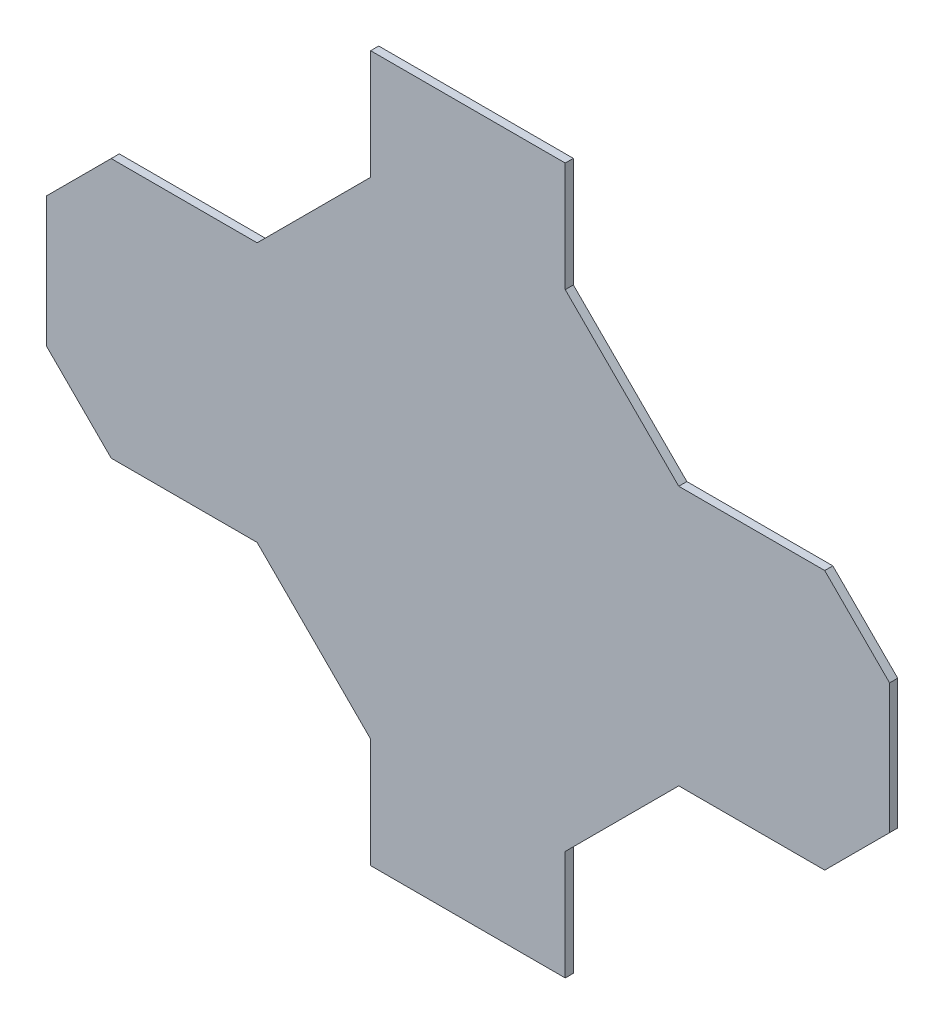
ISO-10303-21;
HEADER;
FILE_DESCRIPTION(('STEP AP214'),'2;1');
FILE_NAME('part.step','',(''),(''),'','','');
FILE_SCHEMA(('AUTOMOTIVE_DESIGN { 1 0 10303 214 1 1 1 1 }'));
ENDSEC;
DATA;
#1=APPLICATION_CONTEXT('core data for automotive mechanical design processes');
#2=APPLICATION_PROTOCOL_DEFINITION('international standard','automotive_design',2000,#1);
#3=PRODUCT_CONTEXT('',#1,'mechanical');
#4=PRODUCT('Part','Part','',(#3));
#5=PRODUCT_RELATED_PRODUCT_CATEGORY('part','',(#4));
#6=PRODUCT_DEFINITION_FORMATION('','',#4);
#7=PRODUCT_DEFINITION_CONTEXT('part definition',#1,'design');
#8=PRODUCT_DEFINITION('design','',#6,#7);
#9=PRODUCT_DEFINITION_SHAPE('','',#8);
#10=(LENGTH_UNIT() NAMED_UNIT(*) SI_UNIT(.MILLI.,.METRE.));
#11=(NAMED_UNIT(*) PLANE_ANGLE_UNIT() SI_UNIT($,.RADIAN.));
#12=(NAMED_UNIT(*) SI_UNIT($,.STERADIAN.) SOLID_ANGLE_UNIT());
#13=UNCERTAINTY_MEASURE_WITH_UNIT(LENGTH_MEASURE(1.E-05),#10,'distance_accuracy_value','');
#14=(GEOMETRIC_REPRESENTATION_CONTEXT(3) GLOBAL_UNCERTAINTY_ASSIGNED_CONTEXT((#13)) GLOBAL_UNIT_ASSIGNED_CONTEXT((#10,
#11,#12)) REPRESENTATION_CONTEXT('',''));
#15=CARTESIAN_POINT('',(0.,0.,0.));
#16=DIRECTION('',(0.,0.,1.));
#17=DIRECTION('',(1.,0.,0.));
#18=AXIS2_PLACEMENT_3D('',#15,#16,#17);
#19=CARTESIAN_POINT('',(-60.,0.,5.));
#20=DIRECTION('',(-1.,0.,0.));
#21=DIRECTION('',(0.,0.,1.));
#22=AXIS2_PLACEMENT_3D('',#19,#20,#21);
#23=PLANE('',#22);
#24=DIRECTION('',(0.,1.,0.));
#25=VECTOR('',#24,1.);
#26=CARTESIAN_POINT('',(-60.,0.,0.));
#27=LINE('',#26,#25);
#28=CARTESIAN_POINT('',(-60.,325.,0.));
#29=VERTEX_POINT('',#28);
#30=CARTESIAN_POINT('',(-60.,392.6,0.));
#31=VERTEX_POINT('',#30);
#32=EDGE_CURVE('E219',#29,#31,#27,.T.);
#33=ORIENTED_EDGE('',*,*,#32,.F.);
#34=DIRECTION('',(0.,0.,1.));
#35=VECTOR('',#34,1.);
#36=CARTESIAN_POINT('',(-60.,325.,5.));
#37=LINE('',#36,#35);
#38=CARTESIAN_POINT('',(-60.,325.,5.));
#39=VERTEX_POINT('',#38);
#40=EDGE_CURVE('E256',#29,#39,#37,.T.);
#41=ORIENTED_EDGE('',*,*,#40,.T.);
#42=DIRECTION('',(0.,1.,0.));
#43=VECTOR('',#42,1.);
#44=CARTESIAN_POINT('',(-60.,0.,5.));
#45=LINE('',#44,#43);
#46=CARTESIAN_POINT('',(-60.,392.6,5.));
#47=VERTEX_POINT('',#46);
#48=EDGE_CURVE('E247',#39,#47,#45,.T.);
#49=ORIENTED_EDGE('',*,*,#48,.T.);
#50=DIRECTION('',(0.,0.,-1.));
#51=VECTOR('',#50,1.);
#52=CARTESIAN_POINT('',(-60.,392.6,5.));
#53=LINE('',#52,#51);
#54=EDGE_CURVE('E218',#47,#31,#53,.T.);
#55=ORIENTED_EDGE('',*,*,#54,.T.);
#56=EDGE_LOOP('',(#33,#41,#49,#55));
#57=FACE_BOUND('',#56,.T.);
#58=ADVANCED_FACE('F35',(#57),#23,.T.);
#59=CARTESIAN_POINT('',(0.,255.,5.));
#60=DIRECTION('',(0.,1.,0.));
#61=DIRECTION('',(0.,0.,1.));
#62=AXIS2_PLACEMENT_3D('',#59,#60,#61);
#63=PLANE('',#62);
#64=DIRECTION('',(1.,0.,0.));
#65=VECTOR('',#64,1.);
#66=CARTESIAN_POINT('',(0.,255.,0.));
#67=LINE('',#66,#65);
#68=CARTESIAN_POINT('',(-220.,255.,0.));
#69=VERTEX_POINT('',#68);
#70=CARTESIAN_POINT('',(-130.,255.,0.));
#71=VERTEX_POINT('',#70);
#72=EDGE_CURVE('E221',#69,#71,#67,.T.);
#73=ORIENTED_EDGE('',*,*,#72,.F.);
#74=DIRECTION('',(0.,0.,1.));
#75=VECTOR('',#74,1.);
#76=CARTESIAN_POINT('',(-220.,255.,5.));
#77=LINE('',#76,#75);
#78=CARTESIAN_POINT('',(-220.,255.,5.));
#79=VERTEX_POINT('',#78);
#80=EDGE_CURVE('E303',#69,#79,#77,.T.);
#81=ORIENTED_EDGE('',*,*,#80,.T.);
#82=DIRECTION('',(1.,0.,0.));
#83=VECTOR('',#82,1.);
#84=CARTESIAN_POINT('',(0.,255.,5.));
#85=LINE('',#84,#83);
#86=CARTESIAN_POINT('',(-130.,255.,5.));
#87=VERTEX_POINT('',#86);
#88=EDGE_CURVE('E354',#79,#87,#85,.T.);
#89=ORIENTED_EDGE('',*,*,#88,.T.);
#90=DIRECTION('',(0.,0.,-1.));
#91=VECTOR('',#90,1.);
#92=CARTESIAN_POINT('',(-130.,255.,0.));
#93=LINE('',#92,#91);
#94=EDGE_CURVE('E184',#87,#71,#93,.T.);
#95=ORIENTED_EDGE('',*,*,#94,.T.);
#96=EDGE_LOOP('',(#73,#81,#89,#95));
#97=FACE_BOUND('',#96,.T.);
#98=ADVANCED_FACE('F362',(#97),#63,.T.);
#99=CARTESIAN_POINT('',(-260.,0.,5.));
#100=DIRECTION('',(-1.,0.,0.));
#101=DIRECTION('',(0.,0.,1.));
#102=AXIS2_PLACEMENT_3D('',#99,#100,#101);
#103=PLANE('',#102);
#104=DIRECTION('',(0.,1.,0.));
#105=VECTOR('',#104,1.);
#106=CARTESIAN_POINT('',(-260.,0.,5.));
#107=LINE('',#106,#105);
#108=CARTESIAN_POINT('',(-260.,135.,5.));
#109=VERTEX_POINT('',#108);
#110=CARTESIAN_POINT('',(-260.,215.,5.));
#111=VERTEX_POINT('',#110);
#112=EDGE_CURVE('E201',#109,#111,#107,.T.);
#113=ORIENTED_EDGE('',*,*,#112,.T.);
#114=DIRECTION('',(0.,0.,-1.));
#115=VECTOR('',#114,1.);
#116=CARTESIAN_POINT('',(-260.,215.,5.));
#117=LINE('',#116,#115);
#118=CARTESIAN_POINT('',(-260.,215.,0.));
#119=VERTEX_POINT('',#118);
#120=EDGE_CURVE('E292',#111,#119,#117,.T.);
#121=ORIENTED_EDGE('',*,*,#120,.T.);
#122=DIRECTION('',(0.,1.,0.));
#123=VECTOR('',#122,1.);
#124=CARTESIAN_POINT('',(-260.,0.,0.));
#125=LINE('',#124,#123);
#126=CARTESIAN_POINT('',(-260.,135.,0.));
#127=VERTEX_POINT('',#126);
#128=EDGE_CURVE('E223',#127,#119,#125,.T.);
#129=ORIENTED_EDGE('',*,*,#128,.F.);
#130=DIRECTION('',(0.,0.,1.));
#131=VECTOR('',#130,1.);
#132=CARTESIAN_POINT('',(-260.,135.,5.));
#133=LINE('',#132,#131);
#134=EDGE_CURVE('E290',#127,#109,#133,.T.);
#135=ORIENTED_EDGE('',*,*,#134,.T.);
#136=EDGE_LOOP('',(#113,#121,#129,#135));
#137=FACE_BOUND('',#136,.T.);
#138=ADVANCED_FACE('F370',(#137),#103,.T.);
#139=CARTESIAN_POINT('',(0.,94.9999999999999,5.));
#140=DIRECTION('',(0.,1.,0.));
#141=DIRECTION('',(0.,0.,1.));
#142=AXIS2_PLACEMENT_3D('',#139,#140,#141);
#143=PLANE('',#142);
#144=DIRECTION('',(1.,0.,0.));
#145=VECTOR('',#144,1.);
#146=CARTESIAN_POINT('',(0.,94.9999999999999,5.));
#147=LINE('',#146,#145);
#148=CARTESIAN_POINT('',(-220.,94.9999999999999,5.));
#149=VERTEX_POINT('',#148);
#150=CARTESIAN_POINT('',(-130.,94.9999999999999,5.));
#151=VERTEX_POINT('',#150);
#152=EDGE_CURVE('E199',#149,#151,#147,.T.);
#153=ORIENTED_EDGE('',*,*,#152,.F.);
#154=DIRECTION('',(0.,0.,-1.));
#155=VECTOR('',#154,1.);
#156=CARTESIAN_POINT('',(-220.,94.9999999999999,0.));
#157=LINE('',#156,#155);
#158=CARTESIAN_POINT('',(-220.,94.9999999999999,0.));
#159=VERTEX_POINT('',#158);
#160=EDGE_CURVE('E312',#149,#159,#157,.T.);
#161=ORIENTED_EDGE('',*,*,#160,.T.);
#162=DIRECTION('',(1.,0.,0.));
#163=VECTOR('',#162,1.);
#164=CARTESIAN_POINT('',(0.,94.9999999999999,0.));
#165=LINE('',#164,#163);
#166=CARTESIAN_POINT('',(-130.,94.9999999999999,0.));
#167=VERTEX_POINT('',#166);
#168=EDGE_CURVE('E226',#159,#167,#165,.T.);
#169=ORIENTED_EDGE('',*,*,#168,.T.);
#170=DIRECTION('',(0.,0.,1.));
#171=VECTOR('',#170,1.);
#172=CARTESIAN_POINT('',(-130.,94.9999999999999,5.));
#173=LINE('',#172,#171);
#174=EDGE_CURVE('E260',#167,#151,#173,.T.);
#175=ORIENTED_EDGE('',*,*,#174,.T.);
#176=EDGE_LOOP('',(#153,#161,#169,#175));
#177=FACE_BOUND('',#176,.T.);
#178=ADVANCED_FACE('F382',(#177),#143,.F.);
#179=CARTESIAN_POINT('',(-60.,0.,5.));
#180=DIRECTION('',(-1.,0.,0.));
#181=DIRECTION('',(0.,0.,1.));
#182=AXIS2_PLACEMENT_3D('',#179,#180,#181);
#183=PLANE('',#182);
#184=DIRECTION('',(0.,1.,0.));
#185=VECTOR('',#184,1.);
#186=CARTESIAN_POINT('',(-60.,0.,5.));
#187=LINE('',#186,#185);
#188=CARTESIAN_POINT('',(-60.,-42.6000000000001,5.));
#189=VERTEX_POINT('',#188);
#190=CARTESIAN_POINT('',(-60.,24.9999999999994,5.));
#191=VERTEX_POINT('',#190);
#192=EDGE_CURVE('E178',#189,#191,#187,.T.);
#193=ORIENTED_EDGE('',*,*,#192,.T.);
#194=DIRECTION('',(0.,0.,-1.));
#195=VECTOR('',#194,1.);
#196=CARTESIAN_POINT('',(-60.,24.9999999999994,5.));
#197=LINE('',#196,#195);
#198=CARTESIAN_POINT('',(-60.,24.9999999999994,0.));
#199=VERTEX_POINT('',#198);
#200=EDGE_CURVE('E258',#191,#199,#197,.T.);
#201=ORIENTED_EDGE('',*,*,#200,.T.);
#202=DIRECTION('',(0.,1.,0.));
#203=VECTOR('',#202,1.);
#204=CARTESIAN_POINT('',(-60.,0.,0.));
#205=LINE('',#204,#203);
#206=CARTESIAN_POINT('',(-60.,-42.6000000000001,0.));
#207=VERTEX_POINT('',#206);
#208=EDGE_CURVE('E181',#207,#199,#205,.T.);
#209=ORIENTED_EDGE('',*,*,#208,.F.);
#210=DIRECTION('',(0.,0.,-1.));
#211=VECTOR('',#210,1.);
#212=CARTESIAN_POINT('',(-60.,-42.6000000000001,5.));
#213=LINE('',#212,#211);
#214=EDGE_CURVE('E173',#189,#207,#213,.T.);
#215=ORIENTED_EDGE('',*,*,#214,.F.);
#216=EDGE_LOOP('',(#193,#201,#209,#215));
#217=FACE_BOUND('',#216,.T.);
#218=ADVANCED_FACE('F175',(#217),#183,.T.);
#219=CARTESIAN_POINT('',(0.,-42.6000000000001,5.));
#220=DIRECTION('',(0.,1.,0.));
#221=DIRECTION('',(0.,0.,1.));
#222=AXIS2_PLACEMENT_3D('',#219,#220,#221);
#223=PLANE('',#222);
#224=DIRECTION('',(1.,0.,0.));
#225=VECTOR('',#224,1.);
#226=CARTESIAN_POINT('',(0.,-42.6000000000001,0.));
#227=LINE('',#226,#225);
#228=CARTESIAN_POINT('',(60.,-42.6000000000001,0.));
#229=VERTEX_POINT('',#228);
#230=EDGE_CURVE('E229',#207,#229,#227,.T.);
#231=ORIENTED_EDGE('',*,*,#230,.T.);
#232=DIRECTION('',(0.,0.,-1.));
#233=VECTOR('',#232,1.);
#234=CARTESIAN_POINT('',(60.,-42.6000000000001,5.));
#235=LINE('',#234,#233);
#236=CARTESIAN_POINT('',(60.,-42.6000000000001,5.));
#237=VERTEX_POINT('',#236);
#238=EDGE_CURVE('E185',#237,#229,#235,.T.);
#239=ORIENTED_EDGE('',*,*,#238,.F.);
#240=DIRECTION('',(1.,0.,0.));
#241=VECTOR('',#240,1.);
#242=CARTESIAN_POINT('',(0.,-42.6000000000001,5.));
#243=LINE('',#242,#241);
#244=EDGE_CURVE('E188',#189,#237,#243,.T.);
#245=ORIENTED_EDGE('',*,*,#244,.F.);
#246=ORIENTED_EDGE('',*,*,#214,.T.);
#247=EDGE_LOOP('',(#231,#239,#245,#246));
#248=FACE_BOUND('',#247,.T.);
#249=ADVANCED_FACE('F189',(#248),#223,.F.);
#250=CARTESIAN_POINT('',(60.,0.,5.));
#251=DIRECTION('',(-1.,0.,0.));
#252=DIRECTION('',(0.,0.,1.));
#253=AXIS2_PLACEMENT_3D('',#250,#251,#252);
#254=PLANE('',#253);
#255=DIRECTION('',(0.,1.,0.));
#256=VECTOR('',#255,1.);
#257=CARTESIAN_POINT('',(60.,0.,0.));
#258=LINE('',#257,#256);
#259=CARTESIAN_POINT('',(60.,25.0000000000003,0.));
#260=VERTEX_POINT('',#259);
#261=EDGE_CURVE('E231',#229,#260,#258,.T.);
#262=ORIENTED_EDGE('',*,*,#261,.T.);
#263=DIRECTION('',(0.,0.,1.));
#264=VECTOR('',#263,1.);
#265=CARTESIAN_POINT('',(60.,25.0000000000003,5.));
#266=LINE('',#265,#264);
#267=CARTESIAN_POINT('',(60.,25.0000000000003,5.));
#268=VERTEX_POINT('',#267);
#269=EDGE_CURVE('E266',#260,#268,#266,.T.);
#270=ORIENTED_EDGE('',*,*,#269,.T.);
#271=DIRECTION('',(0.,1.,0.));
#272=VECTOR('',#271,1.);
#273=CARTESIAN_POINT('',(60.,0.,5.));
#274=LINE('',#273,#272);
#275=EDGE_CURVE('E193',#237,#268,#274,.T.);
#276=ORIENTED_EDGE('',*,*,#275,.F.);
#277=ORIENTED_EDGE('',*,*,#238,.T.);
#278=EDGE_LOOP('',(#262,#270,#276,#277));
#279=FACE_BOUND('',#278,.T.);
#280=ADVANCED_FACE('F388',(#279),#254,.F.);
#281=CARTESIAN_POINT('',(0.,94.9999999999999,5.));
#282=DIRECTION('',(0.,1.,0.));
#283=DIRECTION('',(0.,0.,1.));
#284=AXIS2_PLACEMENT_3D('',#281,#282,#283);
#285=PLANE('',#284);
#286=DIRECTION('',(1.,0.,0.));
#287=VECTOR('',#286,1.);
#288=CARTESIAN_POINT('',(0.,94.9999999999999,0.));
#289=LINE('',#288,#287);
#290=CARTESIAN_POINT('',(130.,94.9999999999999,0.));
#291=VERTEX_POINT('',#290);
#292=CARTESIAN_POINT('',(220.,94.9999999999999,0.));
#293=VERTEX_POINT('',#292);
#294=EDGE_CURVE('E234',#291,#293,#289,.T.);
#295=ORIENTED_EDGE('',*,*,#294,.T.);
#296=DIRECTION('',(0.,0.,1.));
#297=VECTOR('',#296,1.);
#298=CARTESIAN_POINT('',(220.,94.9999999999999,5.));
#299=LINE('',#298,#297);
#300=CARTESIAN_POINT('',(220.,94.9999999999999,5.));
#301=VERTEX_POINT('',#300);
#302=EDGE_CURVE('E11',#293,#301,#299,.T.);
#303=ORIENTED_EDGE('',*,*,#302,.T.);
#304=DIRECTION('',(1.,0.,0.));
#305=VECTOR('',#304,1.);
#306=CARTESIAN_POINT('',(0.,94.9999999999999,5.));
#307=LINE('',#306,#305);
#308=CARTESIAN_POINT('',(130.,94.9999999999999,5.));
#309=VERTEX_POINT('',#308);
#310=EDGE_CURVE('E206',#309,#301,#307,.T.);
#311=ORIENTED_EDGE('',*,*,#310,.F.);
#312=DIRECTION('',(0.,0.,-1.));
#313=VECTOR('',#312,1.);
#314=CARTESIAN_POINT('',(130.,94.9999999999999,0.));
#315=LINE('',#314,#313);
#316=EDGE_CURVE('E263',#309,#291,#315,.T.);
#317=ORIENTED_EDGE('',*,*,#316,.T.);
#318=EDGE_LOOP('',(#295,#303,#311,#317));
#319=FACE_BOUND('',#318,.T.);
#320=ADVANCED_FACE('F396',(#319),#285,.F.);
#321=CARTESIAN_POINT('',(260.,0.,5.));
#322=DIRECTION('',(-1.,0.,0.));
#323=DIRECTION('',(0.,0.,1.));
#324=AXIS2_PLACEMENT_3D('',#321,#322,#323);
#325=PLANE('',#324);
#326=DIRECTION('',(0.,1.,0.));
#327=VECTOR('',#326,1.);
#328=CARTESIAN_POINT('',(260.,0.,0.));
#329=LINE('',#328,#327);
#330=CARTESIAN_POINT('',(260.,135.,0.));
#331=VERTEX_POINT('',#330);
#332=CARTESIAN_POINT('',(260.,215.,0.));
#333=VERTEX_POINT('',#332);
#334=EDGE_CURVE('E237',#331,#333,#329,.T.);
#335=ORIENTED_EDGE('',*,*,#334,.T.);
#336=DIRECTION('',(0.,0.,1.));
#337=VECTOR('',#336,1.);
#338=CARTESIAN_POINT('',(260.,215.,5.));
#339=LINE('',#338,#337);
#340=CARTESIAN_POINT('',(260.,215.,5.));
#341=VERTEX_POINT('',#340);
#342=EDGE_CURVE('E43',#333,#341,#339,.T.);
#343=ORIENTED_EDGE('',*,*,#342,.T.);
#344=DIRECTION('',(0.,1.,0.));
#345=VECTOR('',#344,1.);
#346=CARTESIAN_POINT('',(260.,0.,5.));
#347=LINE('',#346,#345);
#348=CARTESIAN_POINT('',(260.,135.,5.));
#349=VERTEX_POINT('',#348);
#350=EDGE_CURVE('E209',#349,#341,#347,.T.);
#351=ORIENTED_EDGE('',*,*,#350,.F.);
#352=DIRECTION('',(0.,0.,-1.));
#353=VECTOR('',#352,1.);
#354=CARTESIAN_POINT('',(260.,135.,5.));
#355=LINE('',#354,#353);
#356=EDGE_CURVE('E318',#349,#331,#355,.T.);
#357=ORIENTED_EDGE('',*,*,#356,.T.);
#358=EDGE_LOOP('',(#335,#343,#351,#357));
#359=FACE_BOUND('',#358,.T.);
#360=ADVANCED_FACE('F322',(#359),#325,.F.);
#361=CARTESIAN_POINT('',(0.,255.,5.));
#362=DIRECTION('',(0.,1.,0.));
#363=DIRECTION('',(0.,0.,1.));
#364=AXIS2_PLACEMENT_3D('',#361,#362,#363);
#365=PLANE('',#364);
#366=DIRECTION('',(1.,0.,0.));
#367=VECTOR('',#366,1.);
#368=CARTESIAN_POINT('',(0.,255.,5.));
#369=LINE('',#368,#367);
#370=CARTESIAN_POINT('',(130.,255.,5.));
#371=VERTEX_POINT('',#370);
#372=CARTESIAN_POINT('',(220.,255.,5.));
#373=VERTEX_POINT('',#372);
#374=EDGE_CURVE('E211',#371,#373,#369,.T.);
#375=ORIENTED_EDGE('',*,*,#374,.T.);
#376=DIRECTION('',(0.,0.,-1.));
#377=VECTOR('',#376,1.);
#378=CARTESIAN_POINT('',(220.,255.,0.));
#379=LINE('',#378,#377);
#380=CARTESIAN_POINT('',(220.,255.,0.));
#381=VERTEX_POINT('',#380);
#382=EDGE_CURVE('E315',#373,#381,#379,.T.);
#383=ORIENTED_EDGE('',*,*,#382,.T.);
#384=DIRECTION('',(1.,0.,0.));
#385=VECTOR('',#384,1.);
#386=CARTESIAN_POINT('',(0.,255.,0.));
#387=LINE('',#386,#385);
#388=CARTESIAN_POINT('',(130.,255.,0.));
#389=VERTEX_POINT('',#388);
#390=EDGE_CURVE('E239',#389,#381,#387,.T.);
#391=ORIENTED_EDGE('',*,*,#390,.F.);
#392=DIRECTION('',(0.,0.,1.));
#393=VECTOR('',#392,1.);
#394=CARTESIAN_POINT('',(130.,255.,5.));
#395=LINE('',#394,#393);
#396=EDGE_CURVE('E271',#389,#371,#395,.T.);
#397=ORIENTED_EDGE('',*,*,#396,.T.);
#398=EDGE_LOOP('',(#375,#383,#391,#397));
#399=FACE_BOUND('',#398,.T.);
#400=ADVANCED_FACE('F333',(#399),#365,.T.);
#401=CARTESIAN_POINT('',(60.,0.,5.));
#402=DIRECTION('',(-1.,0.,0.));
#403=DIRECTION('',(0.,0.,1.));
#404=AXIS2_PLACEMENT_3D('',#401,#402,#403);
#405=PLANE('',#404);
#406=DIRECTION('',(0.,1.,0.));
#407=VECTOR('',#406,1.);
#408=CARTESIAN_POINT('',(60.,0.,5.));
#409=LINE('',#408,#407);
#410=CARTESIAN_POINT('',(60.,325.,5.));
#411=VERTEX_POINT('',#410);
#412=CARTESIAN_POINT('',(60.,392.6,5.));
#413=VERTEX_POINT('',#412);
#414=EDGE_CURVE('E213',#411,#413,#409,.T.);
#415=ORIENTED_EDGE('',*,*,#414,.F.);
#416=DIRECTION('',(0.,0.,-1.));
#417=VECTOR('',#416,1.);
#418=CARTESIAN_POINT('',(60.,325.,5.));
#419=LINE('',#418,#417);
#420=CARTESIAN_POINT('',(60.,325.,0.));
#421=VERTEX_POINT('',#420);
#422=EDGE_CURVE('E268',#411,#421,#419,.T.);
#423=ORIENTED_EDGE('',*,*,#422,.T.);
#424=DIRECTION('',(0.,1.,0.));
#425=VECTOR('',#424,1.);
#426=CARTESIAN_POINT('',(60.,0.,0.));
#427=LINE('',#426,#425);
#428=CARTESIAN_POINT('',(60.,392.6,0.));
#429=VERTEX_POINT('',#428);
#430=EDGE_CURVE('E242',#421,#429,#427,.T.);
#431=ORIENTED_EDGE('',*,*,#430,.T.);
#432=DIRECTION('',(0.,0.,-1.));
#433=VECTOR('',#432,1.);
#434=CARTESIAN_POINT('',(60.,392.6,5.));
#435=LINE('',#434,#433);
#436=EDGE_CURVE('E250',#413,#429,#435,.T.);
#437=ORIENTED_EDGE('',*,*,#436,.F.);
#438=EDGE_LOOP('',(#415,#423,#431,#437));
#439=FACE_BOUND('',#438,.T.);
#440=ADVANCED_FACE('F342',(#439),#405,.F.);
#441=CARTESIAN_POINT('',(0.,392.6,5.));
#442=DIRECTION('',(0.,1.,0.));
#443=DIRECTION('',(0.,0.,1.));
#444=AXIS2_PLACEMENT_3D('',#441,#442,#443);
#445=PLANE('',#444);
#446=DIRECTION('',(1.,0.,0.));
#447=VECTOR('',#446,1.);
#448=CARTESIAN_POINT('',(0.,392.6,0.));
#449=LINE('',#448,#447);
#450=EDGE_CURVE('E244',#31,#429,#449,.T.);
#451=ORIENTED_EDGE('',*,*,#450,.F.);
#452=ORIENTED_EDGE('',*,*,#54,.F.);
#453=DIRECTION('',(1.,0.,0.));
#454=VECTOR('',#453,1.);
#455=CARTESIAN_POINT('',(0.,392.6,5.));
#456=LINE('',#455,#454);
#457=EDGE_CURVE('E215',#47,#413,#456,.T.);
#458=ORIENTED_EDGE('',*,*,#457,.T.);
#459=ORIENTED_EDGE('',*,*,#436,.T.);
#460=EDGE_LOOP('',(#451,#452,#458,#459));
#461=FACE_BOUND('',#460,.T.);
#462=ADVANCED_FACE('F348',(#461),#445,.T.);
#463=CARTESIAN_POINT('',(0.,0.,5.));
#464=DIRECTION('',(0.,0.,1.));
#465=DIRECTION('',(1.,0.,0.));
#466=AXIS2_PLACEMENT_3D('',#463,#464,#465);
#467=PLANE('',#466);
#468=ORIENTED_EDGE('',*,*,#88,.F.);
#469=DIRECTION('',(0.707106781186549,0.707106781186547,0.));
#470=VECTOR('',#469,1.);
#471=CARTESIAN_POINT('',(-237.5,237.5,5.));
#472=LINE('',#471,#470);
#473=EDGE_CURVE('E310',#79,#111,#472,.F.);
#474=ORIENTED_EDGE('',*,*,#473,.T.);
#475=ORIENTED_EDGE('',*,*,#112,.F.);
#476=DIRECTION('',(0.707106781186546,-0.707106781186549,0.));
#477=VECTOR('',#476,1.);
#478=CARTESIAN_POINT('',(-62.5000000000004,-62.5000000000002,5.));
#479=LINE('',#478,#477);
#480=EDGE_CURVE('E308',#109,#149,#479,.T.);
#481=ORIENTED_EDGE('',*,*,#480,.T.);
#482=ORIENTED_EDGE('',*,*,#152,.T.);
#483=DIRECTION('',(0.707106781186544,-0.707106781186551,0.));
#484=VECTOR('',#483,1.);
#485=CARTESIAN_POINT('',(-60.,24.9999999999994,5.));
#486=LINE('',#485,#484);
#487=EDGE_CURVE('E198',#151,#191,#486,.T.);
#488=ORIENTED_EDGE('',*,*,#487,.T.);
#489=ORIENTED_EDGE('',*,*,#192,.F.);
#490=ORIENTED_EDGE('',*,*,#244,.T.);
#491=ORIENTED_EDGE('',*,*,#275,.T.);
#492=DIRECTION('',(-0.707106781186551,-0.707106781186544,0.));
#493=VECTOR('',#492,1.);
#494=CARTESIAN_POINT('',(130.,94.9999999999999,5.));
#495=LINE('',#494,#493);
#496=EDGE_CURVE('E284',#268,#309,#495,.F.);
#497=ORIENTED_EDGE('',*,*,#496,.T.);
#498=ORIENTED_EDGE('',*,*,#310,.T.);
#499=DIRECTION('',(-0.707106781186549,-0.707106781186547,0.));
#500=VECTOR('',#499,1.);
#501=CARTESIAN_POINT('',(62.4999999999997,-62.4999999999999,5.));
#502=LINE('',#501,#500);
#503=EDGE_CURVE('E305',#301,#349,#502,.F.);
#504=ORIENTED_EDGE('',*,*,#503,.T.);
#505=ORIENTED_EDGE('',*,*,#350,.T.);
#506=DIRECTION('',(-0.707106781186547,0.707106781186549,0.));
#507=VECTOR('',#506,1.);
#508=CARTESIAN_POINT('',(237.5,237.5,5.));
#509=LINE('',#508,#507);
#510=EDGE_CURVE('E50',#341,#373,#509,.T.);
#511=ORIENTED_EDGE('',*,*,#510,.T.);
#512=ORIENTED_EDGE('',*,*,#374,.F.);
#513=DIRECTION('',(-0.707106781186544,0.707106781186551,0.));
#514=VECTOR('',#513,1.);
#515=CARTESIAN_POINT('',(60.,325.,5.));
#516=LINE('',#515,#514);
#517=EDGE_CURVE('E288',#371,#411,#516,.T.);
#518=ORIENTED_EDGE('',*,*,#517,.T.);
#519=ORIENTED_EDGE('',*,*,#414,.T.);
#520=ORIENTED_EDGE('',*,*,#457,.F.);
#521=ORIENTED_EDGE('',*,*,#48,.F.);
#522=DIRECTION('',(0.707106781186551,0.707106781186544,0.));
#523=VECTOR('',#522,1.);
#524=CARTESIAN_POINT('',(-130.,255.,5.));
#525=LINE('',#524,#523);
#526=EDGE_CURVE('E275',#39,#87,#525,.F.);
#527=ORIENTED_EDGE('',*,*,#526,.T.);
#528=EDGE_LOOP('',(#468,#474,#475,#481,#482,#488,#489,#490,#491,#497,#498,#504,#505,#511,#512,
#518,#519,#520,#521,#527));
#529=FACE_BOUND('',#528,.T.);
#530=ADVANCED_FACE('F196',(#529),#467,.T.);
#531=CARTESIAN_POINT('',(0.,0.,0.));
#532=DIRECTION('',(0.,0.,1.));
#533=DIRECTION('',(1.,0.,0.));
#534=AXIS2_PLACEMENT_3D('',#531,#532,#533);
#535=PLANE('',#534);
#536=ORIENTED_EDGE('',*,*,#128,.T.);
#537=DIRECTION('',(-0.707106781186549,-0.707106781186547,0.));
#538=VECTOR('',#537,1.);
#539=CARTESIAN_POINT('',(-260.,215.,0.));
#540=LINE('',#539,#538);
#541=EDGE_CURVE('E301',#119,#69,#540,.F.);
#542=ORIENTED_EDGE('',*,*,#541,.T.);
#543=ORIENTED_EDGE('',*,*,#72,.T.);
#544=DIRECTION('',(-0.707106781186551,-0.707106781186544,0.));
#545=VECTOR('',#544,1.);
#546=CARTESIAN_POINT('',(-192.5,192.500000000001,0.));
#547=LINE('',#546,#545);
#548=EDGE_CURVE('E273',#71,#29,#547,.F.);
#549=ORIENTED_EDGE('',*,*,#548,.T.);
#550=ORIENTED_EDGE('',*,*,#32,.T.);
#551=ORIENTED_EDGE('',*,*,#450,.T.);
#552=ORIENTED_EDGE('',*,*,#430,.F.);
#553=DIRECTION('',(0.707106781186544,-0.707106781186551,0.));
#554=VECTOR('',#553,1.);
#555=CARTESIAN_POINT('',(192.5,192.499999999999,0.));
#556=LINE('',#555,#554);
#557=EDGE_CURVE('E286',#421,#389,#556,.T.);
#558=ORIENTED_EDGE('',*,*,#557,.T.);
#559=ORIENTED_EDGE('',*,*,#390,.T.);
#560=DIRECTION('',(0.707106781186547,-0.707106781186549,0.));
#561=VECTOR('',#560,1.);
#562=CARTESIAN_POINT('',(220.,255.,0.));
#563=LINE('',#562,#561);
#564=EDGE_CURVE('E297',#381,#333,#563,.T.);
#565=ORIENTED_EDGE('',*,*,#564,.T.);
#566=ORIENTED_EDGE('',*,*,#334,.F.);
#567=DIRECTION('',(0.707106781186549,0.707106781186547,0.));
#568=VECTOR('',#567,1.);
#569=CARTESIAN_POINT('',(260.,135.,0.));
#570=LINE('',#569,#568);
#571=EDGE_CURVE('E295',#331,#293,#570,.F.);
#572=ORIENTED_EDGE('',*,*,#571,.T.);
#573=ORIENTED_EDGE('',*,*,#294,.F.);
#574=DIRECTION('',(0.707106781186551,0.707106781186544,0.));
#575=VECTOR('',#574,1.);
#576=CARTESIAN_POINT('',(17.4999999999995,-17.4999999999997,0.));
#577=LINE('',#576,#575);
#578=EDGE_CURVE('E282',#291,#260,#577,.F.);
#579=ORIENTED_EDGE('',*,*,#578,.T.);
#580=ORIENTED_EDGE('',*,*,#261,.F.);
#581=ORIENTED_EDGE('',*,*,#230,.F.);
#582=ORIENTED_EDGE('',*,*,#208,.T.);
#583=DIRECTION('',(-0.707106781186544,0.707106781186551,0.));
#584=VECTOR('',#583,1.);
#585=CARTESIAN_POINT('',(-17.5000000000007,-17.5000000000005,0.));
#586=LINE('',#585,#584);
#587=EDGE_CURVE('E278',#199,#167,#586,.T.);
#588=ORIENTED_EDGE('',*,*,#587,.T.);
#589=ORIENTED_EDGE('',*,*,#168,.F.);
#590=DIRECTION('',(-0.707106781186546,0.707106781186549,0.));
#591=VECTOR('',#590,1.);
#592=CARTESIAN_POINT('',(-220.,94.9999999999999,0.));
#593=LINE('',#592,#591);
#594=EDGE_CURVE('E299',#159,#127,#593,.T.);
#595=ORIENTED_EDGE('',*,*,#594,.T.);
#596=EDGE_LOOP('',(#536,#542,#543,#549,#550,#551,#552,#558,#559,#565,#566,#572,#573,#579,#580,
#581,#582,#588,#589,#595));
#597=FACE_BOUND('',#596,.T.);
#598=ADVANCED_FACE('F326',(#597),#535,.F.);
#599=CARTESIAN_POINT('',(-130.,255.,5.));
#600=DIRECTION('',(-0.707106781186544,0.707106781186551,0.));
#601=DIRECTION('',(0.,0.,1.));
#602=AXIS2_PLACEMENT_3D('',#599,#600,#601);
#603=PLANE('',#602);
#604=ORIENTED_EDGE('',*,*,#526,.F.);
#605=ORIENTED_EDGE('',*,*,#40,.F.);
#606=ORIENTED_EDGE('',*,*,#548,.F.);
#607=ORIENTED_EDGE('',*,*,#94,.F.);
#608=EDGE_LOOP('',(#604,#605,#606,#607));
#609=FACE_BOUND('',#608,.T.);
#610=ADVANCED_FACE('F358',(#609),#603,.T.);
#611=CARTESIAN_POINT('',(-60.,24.9999999999994,5.));
#612=DIRECTION('',(0.707106781186551,0.707106781186544,0.));
#613=DIRECTION('',(0.,0.,-1.));
#614=AXIS2_PLACEMENT_3D('',#611,#612,#613);
#615=PLANE('',#614);
#616=ORIENTED_EDGE('',*,*,#487,.F.);
#617=ORIENTED_EDGE('',*,*,#174,.F.);
#618=ORIENTED_EDGE('',*,*,#587,.F.);
#619=ORIENTED_EDGE('',*,*,#200,.F.);
#620=EDGE_LOOP('',(#616,#617,#618,#619));
#621=FACE_BOUND('',#620,.T.);
#622=ADVANCED_FACE('F385',(#621),#615,.F.);
#623=CARTESIAN_POINT('',(130.,94.9999999999999,5.));
#624=DIRECTION('',(0.707106781186544,-0.707106781186551,0.));
#625=DIRECTION('',(0.,0.,1.));
#626=AXIS2_PLACEMENT_3D('',#623,#624,#625);
#627=PLANE('',#626);
#628=ORIENTED_EDGE('',*,*,#496,.F.);
#629=ORIENTED_EDGE('',*,*,#269,.F.);
#630=ORIENTED_EDGE('',*,*,#578,.F.);
#631=ORIENTED_EDGE('',*,*,#316,.F.);
#632=EDGE_LOOP('',(#628,#629,#630,#631));
#633=FACE_BOUND('',#632,.T.);
#634=ADVANCED_FACE('F394',(#633),#627,.T.);
#635=CARTESIAN_POINT('',(60.,325.,5.));
#636=DIRECTION('',(-0.707106781186551,-0.707106781186544,0.));
#637=DIRECTION('',(0.,0.,-1.));
#638=AXIS2_PLACEMENT_3D('',#635,#636,#637);
#639=PLANE('',#638);
#640=ORIENTED_EDGE('',*,*,#517,.F.);
#641=ORIENTED_EDGE('',*,*,#396,.F.);
#642=ORIENTED_EDGE('',*,*,#557,.F.);
#643=ORIENTED_EDGE('',*,*,#422,.F.);
#644=EDGE_LOOP('',(#640,#641,#642,#643));
#645=FACE_BOUND('',#644,.T.);
#646=ADVANCED_FACE('F339',(#645),#639,.F.);
#647=CARTESIAN_POINT('',(-260.,215.,5.));
#648=DIRECTION('',(0.707106781186547,-0.707106781186549,0.));
#649=DIRECTION('',(0.,0.,-1.));
#650=AXIS2_PLACEMENT_3D('',#647,#648,#649);
#651=PLANE('',#650);
#652=ORIENTED_EDGE('',*,*,#473,.F.);
#653=ORIENTED_EDGE('',*,*,#80,.F.);
#654=ORIENTED_EDGE('',*,*,#541,.F.);
#655=ORIENTED_EDGE('',*,*,#120,.F.);
#656=EDGE_LOOP('',(#652,#653,#654,#655));
#657=FACE_BOUND('',#656,.T.);
#658=ADVANCED_FACE('F375',(#657),#651,.F.);
#659=CARTESIAN_POINT('',(-220.,94.9999999999999,5.));
#660=DIRECTION('',(-0.707106781186549,-0.707106781186546,0.));
#661=DIRECTION('',(0.,0.,1.));
#662=AXIS2_PLACEMENT_3D('',#659,#660,#661);
#663=PLANE('',#662);
#664=ORIENTED_EDGE('',*,*,#480,.F.);
#665=ORIENTED_EDGE('',*,*,#134,.F.);
#666=ORIENTED_EDGE('',*,*,#594,.F.);
#667=ORIENTED_EDGE('',*,*,#160,.F.);
#668=EDGE_LOOP('',(#664,#665,#666,#667));
#669=FACE_BOUND('',#668,.T.);
#670=ADVANCED_FACE('F378',(#669),#663,.T.);
#671=CARTESIAN_POINT('',(220.,255.,5.));
#672=DIRECTION('',(0.707106781186549,0.707106781186547,0.));
#673=DIRECTION('',(0.,0.,1.));
#674=AXIS2_PLACEMENT_3D('',#671,#672,#673);
#675=PLANE('',#674);
#676=ORIENTED_EDGE('',*,*,#510,.F.);
#677=ORIENTED_EDGE('',*,*,#342,.F.);
#678=ORIENTED_EDGE('',*,*,#564,.F.);
#679=ORIENTED_EDGE('',*,*,#382,.F.);
#680=EDGE_LOOP('',(#676,#677,#678,#679));
#681=FACE_BOUND('',#680,.T.);
#682=ADVANCED_FACE('F331',(#681),#675,.T.);
#683=CARTESIAN_POINT('',(260.,135.,5.));
#684=DIRECTION('',(-0.707106781186546,0.707106781186548,0.));
#685=DIRECTION('',(0.,0.,-1.));
#686=AXIS2_PLACEMENT_3D('',#683,#684,#685);
#687=PLANE('',#686);
#688=ORIENTED_EDGE('',*,*,#503,.F.);
#689=ORIENTED_EDGE('',*,*,#302,.F.);
#690=ORIENTED_EDGE('',*,*,#571,.F.);
#691=ORIENTED_EDGE('',*,*,#356,.F.);
#692=EDGE_LOOP('',(#688,#689,#690,#691));
#693=FACE_BOUND('',#692,.T.);
#694=ADVANCED_FACE('F37',(#693),#687,.F.);
#695=CLOSED_SHELL('',(#58,#98,#138,#178,#218,#249,#280,#320,#360,#400,#440,#462,#530,#598,#610,
#622,#634,#646,#658,#670,#682,#694));
#696=MANIFOLD_SOLID_BREP('B2',#695);
#697=ADVANCED_BREP_SHAPE_REPRESENTATION('',(#18,#696),#14);
#698=SHAPE_DEFINITION_REPRESENTATION(#9,#697);
ENDSEC;
END-ISO-10303-21;
